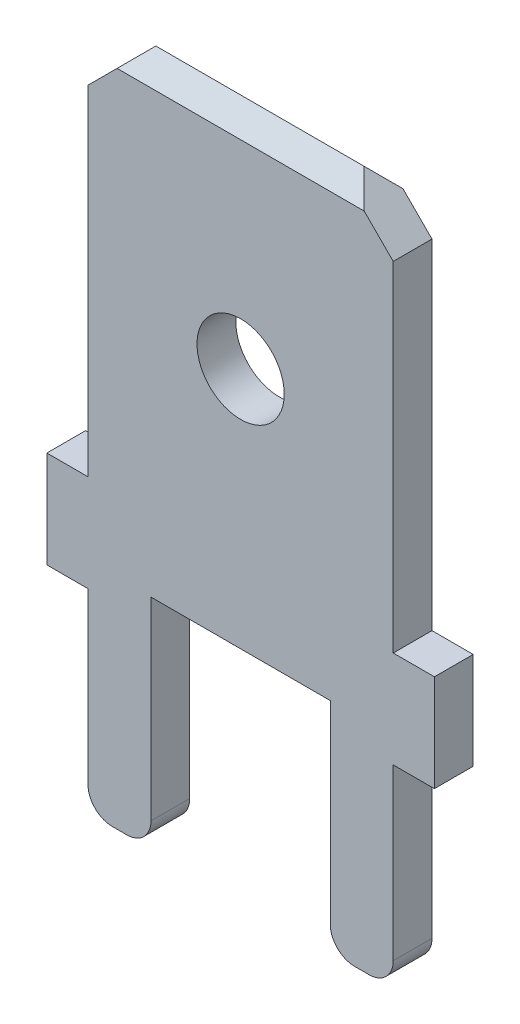
ISO-10303-21;
HEADER;
FILE_DESCRIPTION(('STEP AP214'),'2;1');
FILE_NAME('part.step','',(''),(''),'','','');
FILE_SCHEMA(('AUTOMOTIVE_DESIGN { 1 0 10303 214 1 1 1 1 }'));
ENDSEC;
DATA;
#1=APPLICATION_CONTEXT('core data for automotive mechanical design processes');
#2=APPLICATION_PROTOCOL_DEFINITION('international standard','automotive_design',2000,#1);
#3=PRODUCT_CONTEXT('',#1,'mechanical');
#4=PRODUCT('Part','Part','',(#3));
#5=PRODUCT_RELATED_PRODUCT_CATEGORY('part','',(#4));
#6=PRODUCT_DEFINITION_FORMATION('','',#4);
#7=PRODUCT_DEFINITION_CONTEXT('part definition',#1,'design');
#8=PRODUCT_DEFINITION('design','',#6,#7);
#9=PRODUCT_DEFINITION_SHAPE('','',#8);
#10=(LENGTH_UNIT() NAMED_UNIT(*) SI_UNIT(.MILLI.,.METRE.));
#11=(NAMED_UNIT(*) PLANE_ANGLE_UNIT() SI_UNIT($,.RADIAN.));
#12=(NAMED_UNIT(*) SI_UNIT($,.STERADIAN.) SOLID_ANGLE_UNIT());
#13=UNCERTAINTY_MEASURE_WITH_UNIT(LENGTH_MEASURE(1.E-05),#10,'distance_accuracy_value','');
#14=(GEOMETRIC_REPRESENTATION_CONTEXT(3) GLOBAL_UNCERTAINTY_ASSIGNED_CONTEXT((#13)) GLOBAL_UNIT_ASSIGNED_CONTEXT((#10,
#11,#12)) REPRESENTATION_CONTEXT('',''));
#15=CARTESIAN_POINT('',(0.,0.,0.));
#16=DIRECTION('',(0.,0.,1.));
#17=DIRECTION('',(1.,0.,0.));
#18=AXIS2_PLACEMENT_3D('',#15,#16,#17);
#19=CARTESIAN_POINT('',(-0.65,0.,0.8));
#20=DIRECTION('',(1.,0.,0.));
#21=DIRECTION('',(0.,0.,-1.));
#22=AXIS2_PLACEMENT_3D('',#19,#20,#21);
#23=PLANE('',#22);
#24=DIRECTION('',(0.,-1.,0.));
#25=VECTOR('',#24,1.);
#26=CARTESIAN_POINT('',(-0.65,0.,0.));
#27=LINE('',#26,#25);
#28=CARTESIAN_POINT('',(-0.65,4.,0.));
#29=VERTEX_POINT('',#28);
#30=CARTESIAN_POINT('',(-0.65,0.5,0.));
#31=VERTEX_POINT('',#30);
#32=EDGE_CURVE('E240',#29,#31,#27,.T.);
#33=ORIENTED_EDGE('',*,*,#32,.T.);
#34=DIRECTION('',(0.,0.,-1.));
#35=VECTOR('',#34,1.);
#36=CARTESIAN_POINT('',(-0.65,0.5,0.8));
#37=LINE('',#36,#35);
#38=CARTESIAN_POINT('',(-0.65,0.5,0.8));
#39=VERTEX_POINT('',#38);
#40=EDGE_CURVE('E352',#31,#39,#37,.F.);
#41=ORIENTED_EDGE('',*,*,#40,.T.);
#42=DIRECTION('',(0.,-1.,0.));
#43=VECTOR('',#42,1.);
#44=CARTESIAN_POINT('',(-0.65,0.,0.8));
#45=LINE('',#44,#43);
#46=CARTESIAN_POINT('',(-0.65,4.,0.8));
#47=VERTEX_POINT('',#46);
#48=EDGE_CURVE('E278',#47,#39,#45,.T.);
#49=ORIENTED_EDGE('',*,*,#48,.F.);
#50=DIRECTION('',(0.,0.,-1.));
#51=VECTOR('',#50,1.);
#52=CARTESIAN_POINT('',(-0.65,4.,0.8));
#53=LINE('',#52,#51);
#54=EDGE_CURVE('E239',#47,#29,#53,.T.);
#55=ORIENTED_EDGE('',*,*,#54,.T.);
#56=EDGE_LOOP('',(#33,#41,#49,#55));
#57=FACE_BOUND('',#56,.T.);
#58=ADVANCED_FACE('F32',(#57),#23,.F.);
#59=CARTESIAN_POINT('',(-0.65,0.,0.8));
#60=DIRECTION('',(0.,1.,0.));
#61=DIRECTION('',(0.,0.,1.));
#62=AXIS2_PLACEMENT_3D('',#59,#60,#61);
#63=PLANE('',#62);
#64=DIRECTION('',(1.,0.,0.));
#65=VECTOR('',#64,1.);
#66=CARTESIAN_POINT('',(-0.65,0.,0.8));
#67=LINE('',#66,#65);
#68=CARTESIAN_POINT('',(-0.15,0.,0.8));
#69=VERTEX_POINT('',#68);
#70=CARTESIAN_POINT('',(0.15,0.,0.8));
#71=VERTEX_POINT('',#70);
#72=EDGE_CURVE('E195',#69,#71,#67,.T.);
#73=ORIENTED_EDGE('',*,*,#72,.F.);
#74=DIRECTION('',(0.,0.,-1.));
#75=VECTOR('',#74,1.);
#76=CARTESIAN_POINT('',(-0.15,0.,0.8));
#77=LINE('',#76,#75);
#78=CARTESIAN_POINT('',(-0.15,0.,0.));
#79=VERTEX_POINT('',#78);
#80=EDGE_CURVE('E349',#69,#79,#77,.T.);
#81=ORIENTED_EDGE('',*,*,#80,.T.);
#82=DIRECTION('',(1.,0.,0.));
#83=VECTOR('',#82,1.);
#84=CARTESIAN_POINT('',(-0.65,0.,0.));
#85=LINE('',#84,#83);
#86=CARTESIAN_POINT('',(0.15,0.,0.));
#87=VERTEX_POINT('',#86);
#88=EDGE_CURVE('E243',#79,#87,#85,.T.);
#89=ORIENTED_EDGE('',*,*,#88,.T.);
#90=DIRECTION('',(0.,0.,-1.));
#91=VECTOR('',#90,1.);
#92=CARTESIAN_POINT('',(0.15,0.,0.8));
#93=LINE('',#92,#91);
#94=EDGE_CURVE('E347',#87,#71,#93,.F.);
#95=ORIENTED_EDGE('',*,*,#94,.T.);
#96=EDGE_LOOP('',(#73,#81,#89,#95));
#97=FACE_BOUND('',#96,.T.);
#98=ADVANCED_FACE('F368',(#97),#63,.F.);
#99=CARTESIAN_POINT('',(0.65,0.,0.8));
#100=DIRECTION('',(-1.,0.,0.));
#101=DIRECTION('',(0.,0.,1.));
#102=AXIS2_PLACEMENT_3D('',#99,#100,#101);
#103=PLANE('',#102);
#104=DIRECTION('',(0.,1.,0.));
#105=VECTOR('',#104,1.);
#106=CARTESIAN_POINT('',(0.65,0.,0.8));
#107=LINE('',#106,#105);
#108=CARTESIAN_POINT('',(0.65,0.5,0.8));
#109=VERTEX_POINT('',#108);
#110=CARTESIAN_POINT('',(0.65,4.5,0.8));
#111=VERTEX_POINT('',#110);
#112=EDGE_CURVE('E186',#109,#111,#107,.T.);
#113=ORIENTED_EDGE('',*,*,#112,.F.);
#114=DIRECTION('',(0.,0.,-1.));
#115=VECTOR('',#114,1.);
#116=CARTESIAN_POINT('',(0.65,0.5,0.8));
#117=LINE('',#116,#115);
#118=CARTESIAN_POINT('',(0.65,0.5,0.));
#119=VERTEX_POINT('',#118);
#120=EDGE_CURVE('E11',#109,#119,#117,.T.);
#121=ORIENTED_EDGE('',*,*,#120,.T.);
#122=DIRECTION('',(0.,1.,0.));
#123=VECTOR('',#122,1.);
#124=CARTESIAN_POINT('',(0.65,0.,0.));
#125=LINE('',#124,#123);
#126=CARTESIAN_POINT('',(0.65,4.5,0.));
#127=VERTEX_POINT('',#126);
#128=EDGE_CURVE('E201',#119,#127,#125,.T.);
#129=ORIENTED_EDGE('',*,*,#128,.T.);
#130=DIRECTION('',(0.,0.,-1.));
#131=VECTOR('',#130,1.);
#132=CARTESIAN_POINT('',(0.65,4.5,0.8));
#133=LINE('',#132,#131);
#134=EDGE_CURVE('E198',#111,#127,#133,.T.);
#135=ORIENTED_EDGE('',*,*,#134,.F.);
#136=EDGE_LOOP('',(#113,#121,#129,#135));
#137=FACE_BOUND('',#136,.T.);
#138=ADVANCED_FACE('F199',(#137),#103,.F.);
#139=CARTESIAN_POINT('',(0.65,4.5,0.8));
#140=DIRECTION('',(0.,1.,0.));
#141=DIRECTION('',(0.,0.,1.));
#142=AXIS2_PLACEMENT_3D('',#139,#140,#141);
#143=PLANE('',#142);
#144=DIRECTION('',(1.,0.,0.));
#145=VECTOR('',#144,1.);
#146=CARTESIAN_POINT('',(0.65,4.5,0.));
#147=LINE('',#146,#145);
#148=CARTESIAN_POINT('',(4.35,4.5,0.));
#149=VERTEX_POINT('',#148);
#150=EDGE_CURVE('E248',#127,#149,#147,.T.);
#151=ORIENTED_EDGE('',*,*,#150,.T.);
#152=DIRECTION('',(0.,0.,-1.));
#153=VECTOR('',#152,1.);
#154=CARTESIAN_POINT('',(4.35,4.5,0.8));
#155=LINE('',#154,#153);
#156=CARTESIAN_POINT('',(4.35,4.5,0.8));
#157=VERTEX_POINT('',#156);
#158=EDGE_CURVE('E205',#157,#149,#155,.T.);
#159=ORIENTED_EDGE('',*,*,#158,.F.);
#160=DIRECTION('',(1.,0.,0.));
#161=VECTOR('',#160,1.);
#162=CARTESIAN_POINT('',(0.65,4.5,0.8));
#163=LINE('',#162,#161);
#164=EDGE_CURVE('E191',#111,#157,#163,.T.);
#165=ORIENTED_EDGE('',*,*,#164,.F.);
#166=ORIENTED_EDGE('',*,*,#134,.T.);
#167=EDGE_LOOP('',(#151,#159,#165,#166));
#168=FACE_BOUND('',#167,.T.);
#169=ADVANCED_FACE('F207',(#168),#143,.F.);
#170=CARTESIAN_POINT('',(4.35,4.5,0.8));
#171=DIRECTION('',(1.,0.,0.));
#172=DIRECTION('',(0.,0.,-1.));
#173=AXIS2_PLACEMENT_3D('',#170,#171,#172);
#174=PLANE('',#173);
#175=DIRECTION('',(0.,-1.,0.));
#176=VECTOR('',#175,1.);
#177=CARTESIAN_POINT('',(4.35,4.5,0.));
#178=LINE('',#177,#176);
#179=CARTESIAN_POINT('',(4.35,0.5,0.));
#180=VERTEX_POINT('',#179);
#181=EDGE_CURVE('E250',#149,#180,#178,.T.);
#182=ORIENTED_EDGE('',*,*,#181,.T.);
#183=DIRECTION('',(0.,0.,-1.));
#184=VECTOR('',#183,1.);
#185=CARTESIAN_POINT('',(4.35,0.5,0.8));
#186=LINE('',#185,#184);
#187=CARTESIAN_POINT('',(4.35,0.5,0.8));
#188=VERTEX_POINT('',#187);
#189=EDGE_CURVE('E40',#180,#188,#186,.F.);
#190=ORIENTED_EDGE('',*,*,#189,.T.);
#191=DIRECTION('',(0.,-1.,0.));
#192=VECTOR('',#191,1.);
#193=CARTESIAN_POINT('',(4.35,4.5,0.8));
#194=LINE('',#193,#192);
#195=EDGE_CURVE('E209',#157,#188,#194,.T.);
#196=ORIENTED_EDGE('',*,*,#195,.F.);
#197=ORIENTED_EDGE('',*,*,#158,.T.);
#198=EDGE_LOOP('',(#182,#190,#196,#197));
#199=FACE_BOUND('',#198,.T.);
#200=ADVANCED_FACE('F496',(#199),#174,.F.);
#201=CARTESIAN_POINT('',(4.35,0.,0.8));
#202=DIRECTION('',(0.,1.,0.));
#203=DIRECTION('',(0.,0.,1.));
#204=AXIS2_PLACEMENT_3D('',#201,#202,#203);
#205=PLANE('',#204);
#206=DIRECTION('',(1.,0.,0.));
#207=VECTOR('',#206,1.);
#208=CARTESIAN_POINT('',(4.35,0.,0.));
#209=LINE('',#208,#207);
#210=CARTESIAN_POINT('',(4.85,0.,0.));
#211=VERTEX_POINT('',#210);
#212=CARTESIAN_POINT('',(5.15,0.,0.));
#213=VERTEX_POINT('',#212);
#214=EDGE_CURVE('E252',#211,#213,#209,.T.);
#215=ORIENTED_EDGE('',*,*,#214,.T.);
#216=DIRECTION('',(0.,0.,-1.));
#217=VECTOR('',#216,1.);
#218=CARTESIAN_POINT('',(5.15,0.,0.8));
#219=LINE('',#218,#217);
#220=CARTESIAN_POINT('',(5.15,0.,0.8));
#221=VERTEX_POINT('',#220);
#222=EDGE_CURVE('E338',#213,#221,#219,.F.);
#223=ORIENTED_EDGE('',*,*,#222,.T.);
#224=DIRECTION('',(1.,0.,0.));
#225=VECTOR('',#224,1.);
#226=CARTESIAN_POINT('',(4.35,0.,0.8));
#227=LINE('',#226,#225);
#228=CARTESIAN_POINT('',(4.85,0.,0.8));
#229=VERTEX_POINT('',#228);
#230=EDGE_CURVE('E211',#229,#221,#227,.T.);
#231=ORIENTED_EDGE('',*,*,#230,.F.);
#232=DIRECTION('',(0.,0.,-1.));
#233=VECTOR('',#232,1.);
#234=CARTESIAN_POINT('',(4.85,0.,0.8));
#235=LINE('',#234,#233);
#236=EDGE_CURVE('E335',#229,#211,#235,.T.);
#237=ORIENTED_EDGE('',*,*,#236,.T.);
#238=EDGE_LOOP('',(#215,#223,#231,#237));
#239=FACE_BOUND('',#238,.T.);
#240=ADVANCED_FACE('F431',(#239),#205,.F.);
#241=CARTESIAN_POINT('',(5.65,0.,0.8));
#242=DIRECTION('',(-1.,0.,0.));
#243=DIRECTION('',(0.,0.,1.));
#244=AXIS2_PLACEMENT_3D('',#241,#242,#243);
#245=PLANE('',#244);
#246=DIRECTION('',(0.,1.,0.));
#247=VECTOR('',#246,1.);
#248=CARTESIAN_POINT('',(5.65,0.,0.8));
#249=LINE('',#248,#247);
#250=CARTESIAN_POINT('',(5.65,0.5,0.8));
#251=VERTEX_POINT('',#250);
#252=CARTESIAN_POINT('',(5.65,4.,0.8));
#253=VERTEX_POINT('',#252);
#254=EDGE_CURVE('E216',#251,#253,#249,.T.);
#255=ORIENTED_EDGE('',*,*,#254,.F.);
#256=DIRECTION('',(0.,0.,-1.));
#257=VECTOR('',#256,1.);
#258=CARTESIAN_POINT('',(5.65,0.5,0.8));
#259=LINE('',#258,#257);
#260=CARTESIAN_POINT('',(5.65,0.5,0.));
#261=VERTEX_POINT('',#260);
#262=EDGE_CURVE('E321',#251,#261,#259,.T.);
#263=ORIENTED_EDGE('',*,*,#262,.T.);
#264=DIRECTION('',(0.,1.,0.));
#265=VECTOR('',#264,1.);
#266=CARTESIAN_POINT('',(5.65,0.,0.));
#267=LINE('',#266,#265);
#268=CARTESIAN_POINT('',(5.65,4.,0.));
#269=VERTEX_POINT('',#268);
#270=EDGE_CURVE('E255',#261,#269,#267,.T.);
#271=ORIENTED_EDGE('',*,*,#270,.T.);
#272=DIRECTION('',(0.,0.,-1.));
#273=VECTOR('',#272,1.);
#274=CARTESIAN_POINT('',(5.65,4.,0.8));
#275=LINE('',#274,#273);
#276=EDGE_CURVE('E305',#253,#269,#275,.T.);
#277=ORIENTED_EDGE('',*,*,#276,.F.);
#278=EDGE_LOOP('',(#255,#263,#271,#277));
#279=FACE_BOUND('',#278,.T.);
#280=ADVANCED_FACE('F438',(#279),#245,.F.);
#281=CARTESIAN_POINT('',(6.5,4.,0.8));
#282=DIRECTION('',(0.,1.,0.));
#283=DIRECTION('',(0.,0.,1.));
#284=AXIS2_PLACEMENT_3D('',#281,#282,#283);
#285=PLANE('',#284);
#286=DIRECTION('',(1.,0.,0.));
#287=VECTOR('',#286,1.);
#288=CARTESIAN_POINT('',(6.5,4.,0.));
#289=LINE('',#288,#287);
#290=CARTESIAN_POINT('',(6.5,4.,0.));
#291=VERTEX_POINT('',#290);
#292=EDGE_CURVE('E257',#269,#291,#289,.T.);
#293=ORIENTED_EDGE('',*,*,#292,.T.);
#294=DIRECTION('',(0.,0.,-1.));
#295=VECTOR('',#294,1.);
#296=CARTESIAN_POINT('',(6.5,4.,0.8));
#297=LINE('',#296,#295);
#298=CARTESIAN_POINT('',(6.5,4.,0.8));
#299=VERTEX_POINT('',#298);
#300=EDGE_CURVE('E302',#299,#291,#297,.T.);
#301=ORIENTED_EDGE('',*,*,#300,.F.);
#302=DIRECTION('',(1.,0.,0.));
#303=VECTOR('',#302,1.);
#304=CARTESIAN_POINT('',(6.5,4.,0.8));
#305=LINE('',#304,#303);
#306=EDGE_CURVE('E218',#253,#299,#305,.T.);
#307=ORIENTED_EDGE('',*,*,#306,.F.);
#308=ORIENTED_EDGE('',*,*,#276,.T.);
#309=EDGE_LOOP('',(#293,#301,#307,#308));
#310=FACE_BOUND('',#309,.T.);
#311=ADVANCED_FACE('F443',(#310),#285,.F.);
#312=CARTESIAN_POINT('',(6.5,6.,0.8));
#313=DIRECTION('',(-1.,0.,0.));
#314=DIRECTION('',(0.,0.,1.));
#315=AXIS2_PLACEMENT_3D('',#312,#313,#314);
#316=PLANE('',#315);
#317=DIRECTION('',(0.,1.,0.));
#318=VECTOR('',#317,1.);
#319=CARTESIAN_POINT('',(6.5,6.,0.));
#320=LINE('',#319,#318);
#321=CARTESIAN_POINT('',(6.5,6.,0.));
#322=VERTEX_POINT('',#321);
#323=EDGE_CURVE('E259',#291,#322,#320,.T.);
#324=ORIENTED_EDGE('',*,*,#323,.T.);
#325=DIRECTION('',(0.,0.,-1.));
#326=VECTOR('',#325,1.);
#327=CARTESIAN_POINT('',(6.5,6.,0.8));
#328=LINE('',#327,#326);
#329=CARTESIAN_POINT('',(6.5,6.,0.8));
#330=VERTEX_POINT('',#329);
#331=EDGE_CURVE('E299',#330,#322,#328,.T.);
#332=ORIENTED_EDGE('',*,*,#331,.F.);
#333=DIRECTION('',(0.,1.,0.));
#334=VECTOR('',#333,1.);
#335=CARTESIAN_POINT('',(6.5,6.,0.8));
#336=LINE('',#335,#334);
#337=EDGE_CURVE('E220',#299,#330,#336,.T.);
#338=ORIENTED_EDGE('',*,*,#337,.F.);
#339=ORIENTED_EDGE('',*,*,#300,.T.);
#340=EDGE_LOOP('',(#324,#332,#338,#339));
#341=FACE_BOUND('',#340,.T.);
#342=ADVANCED_FACE('F449',(#341),#316,.F.);
#343=CARTESIAN_POINT('',(5.65,6.,0.8));
#344=DIRECTION('',(0.,-1.,0.));
#345=DIRECTION('',(0.,0.,-1.));
#346=AXIS2_PLACEMENT_3D('',#343,#344,#345);
#347=PLANE('',#346);
#348=DIRECTION('',(-1.,0.,0.));
#349=VECTOR('',#348,1.);
#350=CARTESIAN_POINT('',(5.65,6.,0.));
#351=LINE('',#350,#349);
#352=CARTESIAN_POINT('',(5.65,6.,0.));
#353=VERTEX_POINT('',#352);
#354=EDGE_CURVE('E261',#322,#353,#351,.T.);
#355=ORIENTED_EDGE('',*,*,#354,.T.);
#356=DIRECTION('',(0.,0.,-1.));
#357=VECTOR('',#356,1.);
#358=CARTESIAN_POINT('',(5.65,6.,0.8));
#359=LINE('',#358,#357);
#360=CARTESIAN_POINT('',(5.65,6.,0.8));
#361=VERTEX_POINT('',#360);
#362=EDGE_CURVE('E296',#361,#353,#359,.T.);
#363=ORIENTED_EDGE('',*,*,#362,.F.);
#364=DIRECTION('',(-1.,0.,0.));
#365=VECTOR('',#364,1.);
#366=CARTESIAN_POINT('',(5.65,6.,0.8));
#367=LINE('',#366,#365);
#368=EDGE_CURVE('E222',#330,#361,#367,.T.);
#369=ORIENTED_EDGE('',*,*,#368,.F.);
#370=ORIENTED_EDGE('',*,*,#331,.T.);
#371=EDGE_LOOP('',(#355,#363,#369,#370));
#372=FACE_BOUND('',#371,.T.);
#373=ADVANCED_FACE('F453',(#372),#347,.F.);
#374=CARTESIAN_POINT('',(5.65,13.,0.8));
#375=DIRECTION('',(-1.,0.,0.));
#376=DIRECTION('',(0.,0.,1.));
#377=AXIS2_PLACEMENT_3D('',#374,#375,#376);
#378=PLANE('',#377);
#379=DIRECTION('',(0.,1.,0.));
#380=VECTOR('',#379,1.);
#381=CARTESIAN_POINT('',(5.65,13.,0.));
#382=LINE('',#381,#380);
#383=CARTESIAN_POINT('',(5.65,13.,0.));
#384=VERTEX_POINT('',#383);
#385=EDGE_CURVE('E263',#353,#384,#382,.T.);
#386=ORIENTED_EDGE('',*,*,#385,.T.);
#387=DIRECTION('',(0.,0.,-1.));
#388=VECTOR('',#387,1.);
#389=CARTESIAN_POINT('',(5.65,13.,0.8));
#390=LINE('',#389,#388);
#391=CARTESIAN_POINT('',(5.65,13.,0.8));
#392=VERTEX_POINT('',#391);
#393=EDGE_CURVE('E293',#392,#384,#390,.T.);
#394=ORIENTED_EDGE('',*,*,#393,.F.);
#395=DIRECTION('',(0.,1.,0.));
#396=VECTOR('',#395,1.);
#397=CARTESIAN_POINT('',(5.65,13.,0.8));
#398=LINE('',#397,#396);
#399=EDGE_CURVE('E224',#361,#392,#398,.T.);
#400=ORIENTED_EDGE('',*,*,#399,.F.);
#401=ORIENTED_EDGE('',*,*,#362,.T.);
#402=EDGE_LOOP('',(#386,#394,#400,#401));
#403=FACE_BOUND('',#402,.T.);
#404=ADVANCED_FACE('F458',(#403),#378,.F.);
#405=CARTESIAN_POINT('',(4.65,14.,0.8));
#406=DIRECTION('',(-0.707106781186547,-0.707106781186548,0.));
#407=DIRECTION('',(0.707106781186548,-0.707106781186547,0.));
#408=AXIS2_PLACEMENT_3D('',#405,#406,#407);
#409=PLANE('',#408);
#410=DIRECTION('',(0.577350269189627,-0.577350269189627,-0.577350269189624));
#411=VECTOR('',#410,1.);
#412=CARTESIAN_POINT('',(3.21666666666666,15.4333333333333,1.83333333333333));
#413=LINE('',#412,#411);
#414=CARTESIAN_POINT('',(5.05,13.6,0.));
#415=VERTEX_POINT('',#414);
#416=CARTESIAN_POINT('',(4.65,14.,0.399999999999997));
#417=VERTEX_POINT('',#416);
#418=EDGE_CURVE('E315',#415,#417,#413,.F.);
#419=ORIENTED_EDGE('',*,*,#418,.T.);
#420=DIRECTION('',(0.577350269189626,-0.577350269189626,0.577350269189626));
#421=VECTOR('',#420,1.);
#422=CARTESIAN_POINT('',(3.15,15.5,-1.1));
#423=LINE('',#422,#421);
#424=CARTESIAN_POINT('',(5.05,13.6,0.800000000000001));
#425=VERTEX_POINT('',#424);
#426=EDGE_CURVE('E317',#417,#425,#423,.T.);
#427=ORIENTED_EDGE('',*,*,#426,.T.);
#428=DIRECTION('',(-0.707106781186548,0.707106781186547,0.));
#429=VECTOR('',#428,1.);
#430=CARTESIAN_POINT('',(4.65,14.,0.8));
#431=LINE('',#430,#429);
#432=EDGE_CURVE('E226',#392,#425,#431,.T.);
#433=ORIENTED_EDGE('',*,*,#432,.F.);
#434=ORIENTED_EDGE('',*,*,#393,.T.);
#435=DIRECTION('',(-0.707106781186548,0.707106781186547,0.));
#436=VECTOR('',#435,1.);
#437=CARTESIAN_POINT('',(4.65,14.,0.));
#438=LINE('',#437,#436);
#439=EDGE_CURVE('E265',#384,#415,#438,.T.);
#440=ORIENTED_EDGE('',*,*,#439,.T.);
#441=EDGE_LOOP('',(#419,#427,#433,#434,#440));
#442=FACE_BOUND('',#441,.T.);
#443=ADVANCED_FACE('F474',(#442),#409,.F.);
#444=CARTESIAN_POINT('',(-0.65,13.,0.8));
#445=DIRECTION('',(0.707106781186547,-0.707106781186548,0.));
#446=DIRECTION('',(0.707106781186548,0.707106781186547,0.));
#447=AXIS2_PLACEMENT_3D('',#444,#445,#446);
#448=PLANE('',#447);
#449=DIRECTION('',(-0.707106781186548,-0.707106781186547,0.));
#450=VECTOR('',#449,1.);
#451=CARTESIAN_POINT('',(-0.65,13.,0.8));
#452=LINE('',#451,#450);
#453=CARTESIAN_POINT('',(-0.0500000000000018,13.6,0.8));
#454=VERTEX_POINT('',#453);
#455=CARTESIAN_POINT('',(-0.65,13.,0.8));
#456=VERTEX_POINT('',#455);
#457=EDGE_CURVE('E229',#454,#456,#452,.T.);
#458=ORIENTED_EDGE('',*,*,#457,.F.);
#459=DIRECTION('',(0.577350269189626,0.577350269189626,-0.577350269189626));
#460=VECTOR('',#459,1.);
#461=CARTESIAN_POINT('',(-0.250000000000001,13.4,1.));
#462=LINE('',#461,#460);
#463=CARTESIAN_POINT('',(0.35,14.,0.399999999999998));
#464=VERTEX_POINT('',#463);
#465=EDGE_CURVE('E313',#454,#464,#462,.T.);
#466=ORIENTED_EDGE('',*,*,#465,.T.);
#467=DIRECTION('',(0.577350269189627,0.577350269189626,0.577350269189624));
#468=VECTOR('',#467,1.);
#469=CARTESIAN_POINT('',(0.35,14.,0.399999999999998));
#470=LINE('',#469,#468);
#471=CARTESIAN_POINT('',(-0.05,13.6,0.));
#472=VERTEX_POINT('',#471);
#473=EDGE_CURVE('E311',#464,#472,#470,.F.);
#474=ORIENTED_EDGE('',*,*,#473,.T.);
#475=DIRECTION('',(-0.707106781186548,-0.707106781186547,0.));
#476=VECTOR('',#475,1.);
#477=CARTESIAN_POINT('',(-0.65,13.,0.));
#478=LINE('',#477,#476);
#479=CARTESIAN_POINT('',(-0.65,13.,0.));
#480=VERTEX_POINT('',#479);
#481=EDGE_CURVE('E268',#472,#480,#478,.T.);
#482=ORIENTED_EDGE('',*,*,#481,.T.);
#483=DIRECTION('',(0.,0.,-1.));
#484=VECTOR('',#483,1.);
#485=CARTESIAN_POINT('',(-0.65,13.,0.8));
#486=LINE('',#485,#484);
#487=EDGE_CURVE('E290',#456,#480,#486,.T.);
#488=ORIENTED_EDGE('',*,*,#487,.F.);
#489=EDGE_LOOP('',(#458,#466,#474,#482,#488));
#490=FACE_BOUND('',#489,.T.);
#491=ADVANCED_FACE('F467',(#490),#448,.F.);
#492=CARTESIAN_POINT('',(-0.65,6.,0.8));
#493=DIRECTION('',(1.,0.,0.));
#494=DIRECTION('',(0.,1.,0.));
#495=AXIS2_PLACEMENT_3D('',#492,#493,#494);
#496=PLANE('',#495);
#497=DIRECTION('',(0.,-1.,0.));
#498=VECTOR('',#497,1.);
#499=CARTESIAN_POINT('',(-0.65,6.,0.));
#500=LINE('',#499,#498);
#501=CARTESIAN_POINT('',(-0.65,6.,0.));
#502=VERTEX_POINT('',#501);
#503=EDGE_CURVE('E270',#480,#502,#500,.T.);
#504=ORIENTED_EDGE('',*,*,#503,.T.);
#505=DIRECTION('',(0.,0.,-1.));
#506=VECTOR('',#505,1.);
#507=CARTESIAN_POINT('',(-0.65,6.,0.8));
#508=LINE('',#507,#506);
#509=CARTESIAN_POINT('',(-0.65,6.,0.8));
#510=VERTEX_POINT('',#509);
#511=EDGE_CURVE('E287',#510,#502,#508,.T.);
#512=ORIENTED_EDGE('',*,*,#511,.F.);
#513=DIRECTION('',(0.,-1.,0.));
#514=VECTOR('',#513,1.);
#515=CARTESIAN_POINT('',(-0.65,6.,0.8));
#516=LINE('',#515,#514);
#517=EDGE_CURVE('E231',#456,#510,#516,.T.);
#518=ORIENTED_EDGE('',*,*,#517,.F.);
#519=ORIENTED_EDGE('',*,*,#487,.T.);
#520=EDGE_LOOP('',(#504,#512,#518,#519));
#521=FACE_BOUND('',#520,.T.);
#522=ADVANCED_FACE('F481',(#521),#496,.F.);
#523=CARTESIAN_POINT('',(-1.5,6.,0.8));
#524=DIRECTION('',(0.,-1.,0.));
#525=DIRECTION('',(0.,0.,-1.));
#526=AXIS2_PLACEMENT_3D('',#523,#524,#525);
#527=PLANE('',#526);
#528=DIRECTION('',(-1.,0.,0.));
#529=VECTOR('',#528,1.);
#530=CARTESIAN_POINT('',(-1.5,6.,0.));
#531=LINE('',#530,#529);
#532=CARTESIAN_POINT('',(-1.5,6.,0.));
#533=VERTEX_POINT('',#532);
#534=EDGE_CURVE('E272',#502,#533,#531,.T.);
#535=ORIENTED_EDGE('',*,*,#534,.T.);
#536=DIRECTION('',(0.,0.,-1.));
#537=VECTOR('',#536,1.);
#538=CARTESIAN_POINT('',(-1.5,6.,0.8));
#539=LINE('',#538,#537);
#540=CARTESIAN_POINT('',(-1.5,6.,0.8));
#541=VERTEX_POINT('',#540);
#542=EDGE_CURVE('E284',#541,#533,#539,.T.);
#543=ORIENTED_EDGE('',*,*,#542,.F.);
#544=DIRECTION('',(-1.,0.,0.));
#545=VECTOR('',#544,1.);
#546=CARTESIAN_POINT('',(-1.5,6.,0.8));
#547=LINE('',#546,#545);
#548=EDGE_CURVE('E233',#510,#541,#547,.T.);
#549=ORIENTED_EDGE('',*,*,#548,.F.);
#550=ORIENTED_EDGE('',*,*,#511,.T.);
#551=EDGE_LOOP('',(#535,#543,#549,#550));
#552=FACE_BOUND('',#551,.T.);
#553=ADVANCED_FACE('F548',(#552),#527,.F.);
#554=CARTESIAN_POINT('',(-1.5,4.,0.8));
#555=DIRECTION('',(1.,0.,0.));
#556=DIRECTION('',(0.,0.,-1.));
#557=AXIS2_PLACEMENT_3D('',#554,#555,#556);
#558=PLANE('',#557);
#559=DIRECTION('',(0.,-1.,0.));
#560=VECTOR('',#559,1.);
#561=CARTESIAN_POINT('',(-1.5,4.,0.));
#562=LINE('',#561,#560);
#563=CARTESIAN_POINT('',(-1.5,4.,0.));
#564=VERTEX_POINT('',#563);
#565=EDGE_CURVE('E274',#533,#564,#562,.T.);
#566=ORIENTED_EDGE('',*,*,#565,.T.);
#567=DIRECTION('',(0.,0.,-1.));
#568=VECTOR('',#567,1.);
#569=CARTESIAN_POINT('',(-1.5,4.,0.8));
#570=LINE('',#569,#568);
#571=CARTESIAN_POINT('',(-1.5,4.,0.8));
#572=VERTEX_POINT('',#571);
#573=EDGE_CURVE('E281',#572,#564,#570,.T.);
#574=ORIENTED_EDGE('',*,*,#573,.F.);
#575=DIRECTION('',(0.,-1.,0.));
#576=VECTOR('',#575,1.);
#577=CARTESIAN_POINT('',(-1.5,4.,0.8));
#578=LINE('',#577,#576);
#579=EDGE_CURVE('E235',#541,#572,#578,.T.);
#580=ORIENTED_EDGE('',*,*,#579,.F.);
#581=ORIENTED_EDGE('',*,*,#542,.T.);
#582=EDGE_LOOP('',(#566,#574,#580,#581));
#583=FACE_BOUND('',#582,.T.);
#584=ADVANCED_FACE('F397',(#583),#558,.F.);
#585=CARTESIAN_POINT('',(-0.65,4.,0.8));
#586=DIRECTION('',(0.,1.,0.));
#587=DIRECTION('',(0.,0.,1.));
#588=AXIS2_PLACEMENT_3D('',#585,#586,#587);
#589=PLANE('',#588);
#590=DIRECTION('',(1.,0.,0.));
#591=VECTOR('',#590,1.);
#592=CARTESIAN_POINT('',(-0.65,4.,0.));
#593=LINE('',#592,#591);
#594=EDGE_CURVE('E276',#564,#29,#593,.T.);
#595=ORIENTED_EDGE('',*,*,#594,.T.);
#596=ORIENTED_EDGE('',*,*,#54,.F.);
#597=DIRECTION('',(1.,0.,0.));
#598=VECTOR('',#597,1.);
#599=CARTESIAN_POINT('',(-0.65,4.,0.8));
#600=LINE('',#599,#598);
#601=EDGE_CURVE('E237',#572,#47,#600,.T.);
#602=ORIENTED_EDGE('',*,*,#601,.F.);
#603=ORIENTED_EDGE('',*,*,#573,.T.);
#604=EDGE_LOOP('',(#595,#596,#602,#603));
#605=FACE_BOUND('',#604,.T.);
#606=ADVANCED_FACE('F389',(#605),#589,.F.);
#607=CARTESIAN_POINT('',(-0.65,4.,0.8));
#608=DIRECTION('',(0.,0.,1.));
#609=DIRECTION('',(1.,0.,0.));
#610=AXIS2_PLACEMENT_3D('',#607,#608,#609);
#611=PLANE('',#610);
#612=CARTESIAN_POINT('',(2.5,9.5,0.8));
#613=DIRECTION('',(0.,0.,1.));
#614=DIRECTION('',(1.,0.,0.));
#615=AXIS2_PLACEMENT_3D('',#612,#613,#614);
#616=CIRCLE('',#615,0.9);
#617=CARTESIAN_POINT('',(3.4,9.5,0.8));
#618=VERTEX_POINT('',#617);
#619=EDGE_CURVE('E375',#618,#618,#616,.T.);
#620=ORIENTED_EDGE('',*,*,#619,.F.);
#621=EDGE_LOOP('',(#620));
#622=FACE_BOUND('',#621,.T.);
#623=ORIENTED_EDGE('',*,*,#230,.T.);
#624=CARTESIAN_POINT('',(5.15,0.5,0.8));
#625=DIRECTION('',(0.,0.,1.));
#626=DIRECTION('',(1.,0.,0.));
#627=AXIS2_PLACEMENT_3D('',#624,#625,#626);
#628=CIRCLE('',#627,0.5);
#629=EDGE_CURVE('E345',#221,#251,#628,.T.);
#630=ORIENTED_EDGE('',*,*,#629,.T.);
#631=ORIENTED_EDGE('',*,*,#254,.T.);
#632=ORIENTED_EDGE('',*,*,#306,.T.);
#633=ORIENTED_EDGE('',*,*,#337,.T.);
#634=ORIENTED_EDGE('',*,*,#368,.T.);
#635=ORIENTED_EDGE('',*,*,#399,.T.);
#636=ORIENTED_EDGE('',*,*,#432,.T.);
#637=DIRECTION('',(-1.,0.,0.));
#638=VECTOR('',#637,1.);
#639=CARTESIAN_POINT('',(0.35,13.6,0.8));
#640=LINE('',#639,#638);
#641=EDGE_CURVE('E204',#425,#454,#640,.T.);
#642=ORIENTED_EDGE('',*,*,#641,.T.);
#643=ORIENTED_EDGE('',*,*,#457,.T.);
#644=ORIENTED_EDGE('',*,*,#517,.T.);
#645=ORIENTED_EDGE('',*,*,#548,.T.);
#646=ORIENTED_EDGE('',*,*,#579,.T.);
#647=ORIENTED_EDGE('',*,*,#601,.T.);
#648=ORIENTED_EDGE('',*,*,#48,.T.);
#649=CARTESIAN_POINT('',(-0.15,0.5,0.8));
#650=DIRECTION('',(0.,0.,1.));
#651=DIRECTION('',(1.,0.,0.));
#652=AXIS2_PLACEMENT_3D('',#649,#650,#651);
#653=CIRCLE('',#652,0.5);
#654=EDGE_CURVE('E343',#39,#69,#653,.T.);
#655=ORIENTED_EDGE('',*,*,#654,.T.);
#656=ORIENTED_EDGE('',*,*,#72,.T.);
#657=CARTESIAN_POINT('',(0.15,0.5,0.8));
#658=DIRECTION('',(0.,0.,1.));
#659=DIRECTION('',(1.,0.,0.));
#660=AXIS2_PLACEMENT_3D('',#657,#658,#659);
#661=CIRCLE('',#660,0.5);
#662=EDGE_CURVE('E54',#71,#109,#661,.T.);
#663=ORIENTED_EDGE('',*,*,#662,.T.);
#664=ORIENTED_EDGE('',*,*,#112,.T.);
#665=ORIENTED_EDGE('',*,*,#164,.T.);
#666=ORIENTED_EDGE('',*,*,#195,.T.);
#667=CARTESIAN_POINT('',(4.85,0.5,0.8));
#668=DIRECTION('',(0.,0.,1.));
#669=DIRECTION('',(1.,0.,0.));
#670=AXIS2_PLACEMENT_3D('',#667,#668,#669);
#671=CIRCLE('',#670,0.5);
#672=EDGE_CURVE('E341',#188,#229,#671,.T.);
#673=ORIENTED_EDGE('',*,*,#672,.T.);
#674=EDGE_LOOP('',(#623,#630,#631,#632,#633,#634,#635,#636,#642,#643,#644,#645,#646,#647,#648,
#655,#656,#663,#664,#665,#666,#673));
#675=FACE_BOUND('',#674,.T.);
#676=ADVANCED_FACE('F189',(#622,#675),#611,.T.);
#677=CARTESIAN_POINT('',(-0.65,4.,0.));
#678=DIRECTION('',(0.,0.,1.));
#679=DIRECTION('',(1.,0.,0.));
#680=AXIS2_PLACEMENT_3D('',#677,#678,#679);
#681=PLANE('',#680);
#682=CARTESIAN_POINT('',(2.5,9.5,0.));
#683=DIRECTION('',(0.,0.,1.));
#684=DIRECTION('',(1.,0.,0.));
#685=AXIS2_PLACEMENT_3D('',#682,#683,#684);
#686=CIRCLE('',#685,0.9);
#687=CARTESIAN_POINT('',(3.4,9.5,0.));
#688=VERTEX_POINT('',#687);
#689=EDGE_CURVE('E324',#688,#688,#686,.T.);
#690=ORIENTED_EDGE('',*,*,#689,.T.);
#691=EDGE_LOOP('',(#690));
#692=FACE_BOUND('',#691,.T.);
#693=ORIENTED_EDGE('',*,*,#270,.F.);
#694=CARTESIAN_POINT('',(5.15,0.5,0.));
#695=DIRECTION('',(0.,0.,1.));
#696=DIRECTION('',(1.,0.,0.));
#697=AXIS2_PLACEMENT_3D('',#694,#695,#696);
#698=CIRCLE('',#697,0.5);
#699=EDGE_CURVE('E333',#261,#213,#698,.F.);
#700=ORIENTED_EDGE('',*,*,#699,.T.);
#701=ORIENTED_EDGE('',*,*,#214,.F.);
#702=CARTESIAN_POINT('',(4.85,0.5,0.));
#703=DIRECTION('',(0.,0.,1.));
#704=DIRECTION('',(1.,0.,0.));
#705=AXIS2_PLACEMENT_3D('',#702,#703,#704);
#706=CIRCLE('',#705,0.5);
#707=EDGE_CURVE('E329',#211,#180,#706,.F.);
#708=ORIENTED_EDGE('',*,*,#707,.T.);
#709=ORIENTED_EDGE('',*,*,#181,.F.);
#710=ORIENTED_EDGE('',*,*,#150,.F.);
#711=ORIENTED_EDGE('',*,*,#128,.F.);
#712=CARTESIAN_POINT('',(0.15,0.5,0.));
#713=DIRECTION('',(0.,0.,1.));
#714=DIRECTION('',(1.,0.,0.));
#715=AXIS2_PLACEMENT_3D('',#712,#713,#714);
#716=CIRCLE('',#715,0.5);
#717=EDGE_CURVE('E327',#119,#87,#716,.F.);
#718=ORIENTED_EDGE('',*,*,#717,.T.);
#719=ORIENTED_EDGE('',*,*,#88,.F.);
#720=CARTESIAN_POINT('',(-0.15,0.5,0.));
#721=DIRECTION('',(0.,0.,1.));
#722=DIRECTION('',(1.,0.,0.));
#723=AXIS2_PLACEMENT_3D('',#720,#721,#722);
#724=CIRCLE('',#723,0.5);
#725=EDGE_CURVE('E331',#79,#31,#724,.F.);
#726=ORIENTED_EDGE('',*,*,#725,.T.);
#727=ORIENTED_EDGE('',*,*,#32,.F.);
#728=ORIENTED_EDGE('',*,*,#594,.F.);
#729=ORIENTED_EDGE('',*,*,#565,.F.);
#730=ORIENTED_EDGE('',*,*,#534,.F.);
#731=ORIENTED_EDGE('',*,*,#503,.F.);
#732=ORIENTED_EDGE('',*,*,#481,.F.);
#733=DIRECTION('',(1.,0.,0.));
#734=VECTOR('',#733,1.);
#735=CARTESIAN_POINT('',(-0.65,13.6,0.));
#736=LINE('',#735,#734);
#737=EDGE_CURVE('E319',#472,#415,#736,.T.);
#738=ORIENTED_EDGE('',*,*,#737,.T.);
#739=ORIENTED_EDGE('',*,*,#439,.F.);
#740=ORIENTED_EDGE('',*,*,#385,.F.);
#741=ORIENTED_EDGE('',*,*,#354,.F.);
#742=ORIENTED_EDGE('',*,*,#323,.F.);
#743=ORIENTED_EDGE('',*,*,#292,.F.);
#744=EDGE_LOOP('',(#693,#700,#701,#708,#709,#710,#711,#718,#719,#726,#727,#728,#729,#730,#731,
#732,#738,#739,#740,#741,#742,#743));
#745=FACE_BOUND('',#744,.T.);
#746=ADVANCED_FACE('F372',(#692,#745),#681,.F.);
#747=CARTESIAN_POINT('',(0.35,14.,0.399999999999998));
#748=DIRECTION('',(0.,-0.707106781186546,0.707106781186549));
#749=DIRECTION('',(0.,-0.707106781186549,-0.707106781186546));
#750=AXIS2_PLACEMENT_3D('',#747,#748,#749);
#751=PLANE('',#750);
#752=DIRECTION('',(-1.,0.,0.));
#753=VECTOR('',#752,1.);
#754=CARTESIAN_POINT('',(0.35,14.,0.399999999999998));
#755=LINE('',#754,#753);
#756=EDGE_CURVE('E244',#417,#464,#755,.T.);
#757=ORIENTED_EDGE('',*,*,#756,.F.);
#758=ORIENTED_EDGE('',*,*,#418,.F.);
#759=ORIENTED_EDGE('',*,*,#737,.F.);
#760=ORIENTED_EDGE('',*,*,#473,.F.);
#761=EDGE_LOOP('',(#757,#758,#759,#760));
#762=FACE_BOUND('',#761,.T.);
#763=ADVANCED_FACE('F395',(#762),#751,.F.);
#764=CARTESIAN_POINT('',(-0.65,13.6,0.8));
#765=DIRECTION('',(0.,0.707106781186547,0.707106781186547));
#766=DIRECTION('',(0.,-0.707106781186548,0.707106781186548));
#767=AXIS2_PLACEMENT_3D('',#764,#765,#766);
#768=PLANE('',#767);
#769=ORIENTED_EDGE('',*,*,#426,.F.);
#770=ORIENTED_EDGE('',*,*,#756,.T.);
#771=ORIENTED_EDGE('',*,*,#465,.F.);
#772=ORIENTED_EDGE('',*,*,#641,.F.);
#773=EDGE_LOOP('',(#769,#770,#771,#772));
#774=FACE_BOUND('',#773,.T.);
#775=ADVANCED_FACE('F408',(#774),#768,.T.);
#776=CARTESIAN_POINT('',(5.15,0.5,0.8));
#777=DIRECTION('',(0.,0.,-1.));
#778=DIRECTION('',(-1.,0.,0.));
#779=AXIS2_PLACEMENT_3D('',#776,#777,#778);
#780=CYLINDRICAL_SURFACE('',#779,0.5);
#781=ORIENTED_EDGE('',*,*,#629,.F.);
#782=ORIENTED_EDGE('',*,*,#222,.F.);
#783=ORIENTED_EDGE('',*,*,#699,.F.);
#784=ORIENTED_EDGE('',*,*,#262,.F.);
#785=EDGE_LOOP('',(#781,#782,#783,#784));
#786=FACE_BOUND('',#785,.T.);
#787=ADVANCED_FACE('F411',(#786),#780,.T.);
#788=CARTESIAN_POINT('',(-0.15,0.5,0.8));
#789=DIRECTION('',(0.,0.,-1.));
#790=DIRECTION('',(-1.,0.,0.));
#791=AXIS2_PLACEMENT_3D('',#788,#789,#790);
#792=CYLINDRICAL_SURFACE('',#791,0.5);
#793=ORIENTED_EDGE('',*,*,#654,.F.);
#794=ORIENTED_EDGE('',*,*,#40,.F.);
#795=ORIENTED_EDGE('',*,*,#725,.F.);
#796=ORIENTED_EDGE('',*,*,#80,.F.);
#797=EDGE_LOOP('',(#793,#794,#795,#796));
#798=FACE_BOUND('',#797,.T.);
#799=ADVANCED_FACE('F365',(#798),#792,.T.);
#800=CARTESIAN_POINT('',(4.85,0.5,0.8));
#801=DIRECTION('',(0.,0.,-1.));
#802=DIRECTION('',(-1.,0.,0.));
#803=AXIS2_PLACEMENT_3D('',#800,#801,#802);
#804=CYLINDRICAL_SURFACE('',#803,0.5);
#805=ORIENTED_EDGE('',*,*,#672,.F.);
#806=ORIENTED_EDGE('',*,*,#189,.F.);
#807=ORIENTED_EDGE('',*,*,#707,.F.);
#808=ORIENTED_EDGE('',*,*,#236,.F.);
#809=EDGE_LOOP('',(#805,#806,#807,#808));
#810=FACE_BOUND('',#809,.T.);
#811=ADVANCED_FACE('F420',(#810),#804,.T.);
#812=CARTESIAN_POINT('',(0.15,0.5,0.8));
#813=DIRECTION('',(0.,0.,-1.));
#814=DIRECTION('',(-1.,0.,0.));
#815=AXIS2_PLACEMENT_3D('',#812,#813,#814);
#816=CYLINDRICAL_SURFACE('',#815,0.5);
#817=ORIENTED_EDGE('',*,*,#662,.F.);
#818=ORIENTED_EDGE('',*,*,#94,.F.);
#819=ORIENTED_EDGE('',*,*,#717,.F.);
#820=ORIENTED_EDGE('',*,*,#120,.F.);
#821=EDGE_LOOP('',(#817,#818,#819,#820));
#822=FACE_BOUND('',#821,.T.);
#823=ADVANCED_FACE('F34',(#822),#816,.T.);
#824=CARTESIAN_POINT('',(2.5,9.5,0.));
#825=DIRECTION('',(0.,0.,1.));
#826=DIRECTION('',(1.,0.,0.));
#827=AXIS2_PLACEMENT_3D('',#824,#825,#826);
#828=CYLINDRICAL_SURFACE('',#827,0.9);
#829=ORIENTED_EDGE('',*,*,#689,.F.);
#830=EDGE_LOOP('',(#829));
#831=FACE_BOUND('',#830,.T.);
#832=ORIENTED_EDGE('',*,*,#619,.T.);
#833=EDGE_LOOP('',(#832));
#834=FACE_BOUND('',#833,.T.);
#835=ADVANCED_FACE('F382',(#831,#834),#828,.F.);
#836=CLOSED_SHELL('',(#58,#98,#138,#169,#200,#240,#280,#311,#342,#373,#404,#443,#491,#522,#553,
#584,#606,#676,#746,#763,#775,#787,#799,#811,#823,#835));
#837=MANIFOLD_SOLID_BREP('B2',#836);
#838=ADVANCED_BREP_SHAPE_REPRESENTATION('',(#18,#837),#14);
#839=SHAPE_DEFINITION_REPRESENTATION(#9,#838);
ENDSEC;
END-ISO-10303-21;
